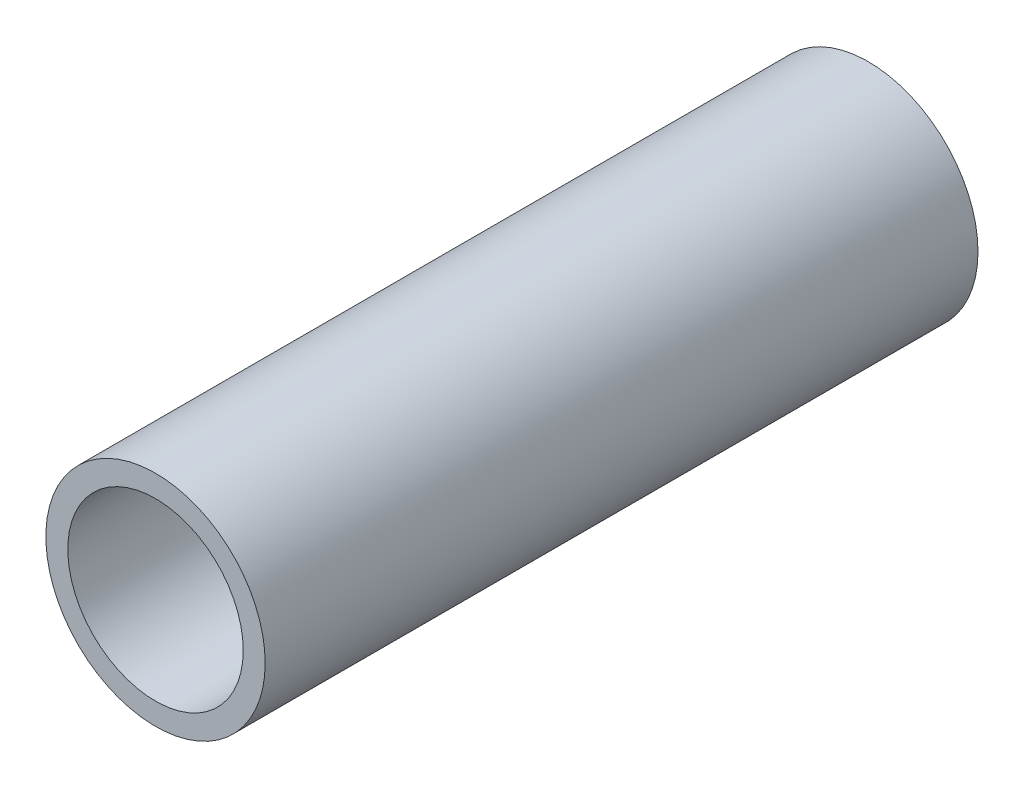
ISO-10303-21;
HEADER;
FILE_DESCRIPTION(('STEP AP214'),'2;1');
FILE_NAME('part.step','',(''),(''),'','','');
FILE_SCHEMA(('AUTOMOTIVE_DESIGN { 1 0 10303 214 1 1 1 1 }'));
ENDSEC;
DATA;
#1=APPLICATION_CONTEXT('core data for automotive mechanical design processes');
#2=APPLICATION_PROTOCOL_DEFINITION('international standard','automotive_design',2000,#1);
#3=PRODUCT_CONTEXT('',#1,'mechanical');
#4=PRODUCT('Part','Part','',(#3));
#5=PRODUCT_RELATED_PRODUCT_CATEGORY('part','',(#4));
#6=PRODUCT_DEFINITION_FORMATION('','',#4);
#7=PRODUCT_DEFINITION_CONTEXT('part definition',#1,'design');
#8=PRODUCT_DEFINITION('design','',#6,#7);
#9=PRODUCT_DEFINITION_SHAPE('','',#8);
#10=(LENGTH_UNIT() NAMED_UNIT(*) SI_UNIT(.MILLI.,.METRE.));
#11=(NAMED_UNIT(*) PLANE_ANGLE_UNIT() SI_UNIT($,.RADIAN.));
#12=(NAMED_UNIT(*) SI_UNIT($,.STERADIAN.) SOLID_ANGLE_UNIT());
#13=UNCERTAINTY_MEASURE_WITH_UNIT(LENGTH_MEASURE(1.E-05),#10,'distance_accuracy_value','');
#14=(GEOMETRIC_REPRESENTATION_CONTEXT(3) GLOBAL_UNCERTAINTY_ASSIGNED_CONTEXT((#13)) GLOBAL_UNIT_ASSIGNED_CONTEXT((#10,
#11,#12)) REPRESENTATION_CONTEXT('',''));
#15=CARTESIAN_POINT('',(0.,0.,0.));
#16=DIRECTION('',(0.,0.,1.));
#17=DIRECTION('',(1.,0.,0.));
#18=AXIS2_PLACEMENT_3D('',#15,#16,#17);
#19=CARTESIAN_POINT('',(0.,0.,65.));
#20=DIRECTION('',(0.,0.,1.));
#21=DIRECTION('',(1.,0.,0.));
#22=AXIS2_PLACEMENT_3D('',#19,#20,#21);
#23=PLANE('',#22);
#24=CARTESIAN_POINT('',(0.,0.,65.));
#25=DIRECTION('',(0.,0.,1.));
#26=DIRECTION('',(1.,0.,0.));
#27=AXIS2_PLACEMENT_3D('',#24,#25,#26);
#28=CIRCLE('',#27,10.);
#29=CARTESIAN_POINT('',(10.,0.,65.));
#30=VERTEX_POINT('',#29);
#31=EDGE_CURVE('E10',#30,#30,#28,.T.);
#32=ORIENTED_EDGE('',*,*,#31,.T.);
#33=EDGE_LOOP('',(#32));
#34=FACE_BOUND('',#33,.T.);
#35=CARTESIAN_POINT('',(0.,0.,65.));
#36=DIRECTION('',(0.,0.,1.));
#37=DIRECTION('',(1.,0.,0.));
#38=AXIS2_PLACEMENT_3D('',#35,#36,#37);
#39=CIRCLE('',#38,8.);
#40=CARTESIAN_POINT('',(8.,0.,65.));
#41=VERTEX_POINT('',#40);
#42=EDGE_CURVE('E48',#41,#41,#39,.T.);
#43=ORIENTED_EDGE('',*,*,#42,.F.);
#44=EDGE_LOOP('',(#43));
#45=FACE_BOUND('',#44,.T.);
#46=ADVANCED_FACE('F37',(#34,#45),#23,.T.);
#47=CARTESIAN_POINT('',(0.,0.,0.));
#48=DIRECTION('',(0.,0.,1.));
#49=DIRECTION('',(1.,0.,0.));
#50=AXIS2_PLACEMENT_3D('',#47,#48,#49);
#51=PLANE('',#50);
#52=CARTESIAN_POINT('',(0.,0.,0.));
#53=DIRECTION('',(0.,0.,1.));
#54=DIRECTION('',(1.,0.,0.));
#55=AXIS2_PLACEMENT_3D('',#52,#53,#54);
#56=CIRCLE('',#55,10.);
#57=CARTESIAN_POINT('',(10.,0.,0.));
#58=VERTEX_POINT('',#57);
#59=EDGE_CURVE('E41',#58,#58,#56,.T.);
#60=ORIENTED_EDGE('',*,*,#59,.F.);
#61=EDGE_LOOP('',(#60));
#62=FACE_BOUND('',#61,.T.);
#63=CARTESIAN_POINT('',(0.,0.,0.));
#64=DIRECTION('',(0.,0.,1.));
#65=DIRECTION('',(1.,0.,0.));
#66=AXIS2_PLACEMENT_3D('',#63,#64,#65);
#67=CIRCLE('',#66,8.);
#68=CARTESIAN_POINT('',(8.,0.,0.));
#69=VERTEX_POINT('',#68);
#70=EDGE_CURVE('E50',#69,#69,#67,.T.);
#71=ORIENTED_EDGE('',*,*,#70,.T.);
#72=EDGE_LOOP('',(#71));
#73=FACE_BOUND('',#72,.T.);
#74=ADVANCED_FACE('F60',(#62,#73),#51,.F.);
#75=CARTESIAN_POINT('',(0.,0.,65.));
#76=DIRECTION('',(0.,0.,-1.));
#77=DIRECTION('',(-1.,0.,0.));
#78=AXIS2_PLACEMENT_3D('',#75,#76,#77);
#79=CYLINDRICAL_SURFACE('',#78,10.);
#80=ORIENTED_EDGE('',*,*,#31,.F.);
#81=EDGE_LOOP('',(#80));
#82=FACE_BOUND('',#81,.T.);
#83=ORIENTED_EDGE('',*,*,#59,.T.);
#84=EDGE_LOOP('',(#83));
#85=FACE_BOUND('',#84,.T.);
#86=ADVANCED_FACE('F39',(#82,#85),#79,.T.);
#87=CARTESIAN_POINT('',(0.,0.,65.));
#88=DIRECTION('',(0.,0.,-1.));
#89=DIRECTION('',(-1.,0.,0.));
#90=AXIS2_PLACEMENT_3D('',#87,#88,#89);
#91=CYLINDRICAL_SURFACE('',#90,8.);
#92=ORIENTED_EDGE('',*,*,#42,.T.);
#93=EDGE_LOOP('',(#92));
#94=FACE_BOUND('',#93,.T.);
#95=ORIENTED_EDGE('',*,*,#70,.F.);
#96=EDGE_LOOP('',(#95));
#97=FACE_BOUND('',#96,.T.);
#98=ADVANCED_FACE('F56',(#94,#97),#91,.F.);
#99=CLOSED_SHELL('',(#46,#74,#86,#98));
#100=MANIFOLD_SOLID_BREP('B2',#99);
#101=ADVANCED_BREP_SHAPE_REPRESENTATION('',(#18,#100),#14);
#102=SHAPE_DEFINITION_REPRESENTATION(#9,#101);
ENDSEC;
END-ISO-10303-21;
